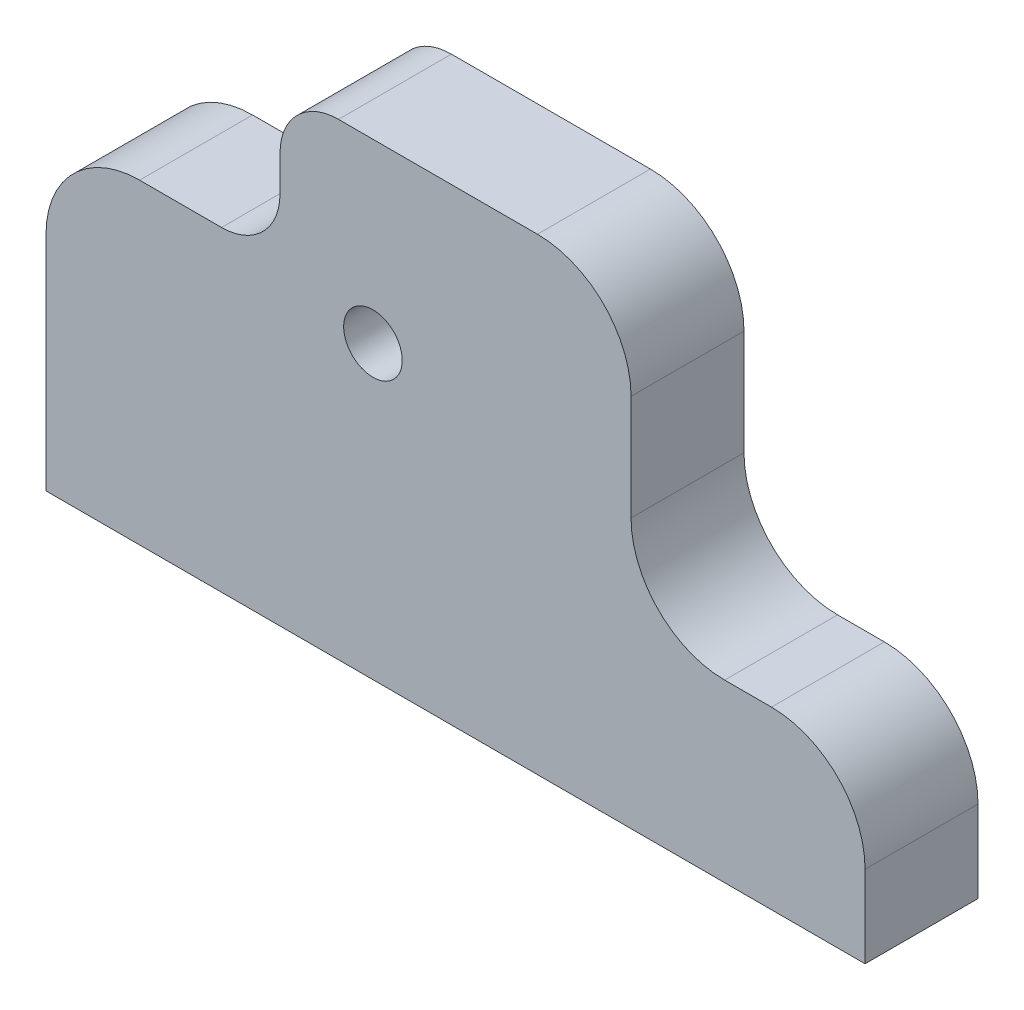
ISO-10303-21;
HEADER;
FILE_DESCRIPTION(('STEP AP214'),'2;1');
FILE_NAME('part.step','',(''),(''),'','','');
FILE_SCHEMA(('AUTOMOTIVE_DESIGN { 1 0 10303 214 1 1 1 1 }'));
ENDSEC;
DATA;
#1=APPLICATION_CONTEXT('core data for automotive mechanical design processes');
#2=APPLICATION_PROTOCOL_DEFINITION('international standard','automotive_design',2000,#1);
#3=PRODUCT_CONTEXT('',#1,'mechanical');
#4=PRODUCT('Part','Part','',(#3));
#5=PRODUCT_RELATED_PRODUCT_CATEGORY('part','',(#4));
#6=PRODUCT_DEFINITION_FORMATION('','',#4);
#7=PRODUCT_DEFINITION_CONTEXT('part definition',#1,'design');
#8=PRODUCT_DEFINITION('design','',#6,#7);
#9=PRODUCT_DEFINITION_SHAPE('','',#8);
#10=(LENGTH_UNIT() NAMED_UNIT(*) SI_UNIT(.MILLI.,.METRE.));
#11=(NAMED_UNIT(*) PLANE_ANGLE_UNIT() SI_UNIT($,.RADIAN.));
#12=(NAMED_UNIT(*) SI_UNIT($,.STERADIAN.) SOLID_ANGLE_UNIT());
#13=UNCERTAINTY_MEASURE_WITH_UNIT(LENGTH_MEASURE(1.E-05),#10,'distance_accuracy_value','');
#14=(GEOMETRIC_REPRESENTATION_CONTEXT(3) GLOBAL_UNCERTAINTY_ASSIGNED_CONTEXT((#13)) GLOBAL_UNIT_ASSIGNED_CONTEXT((#10,
#11,#12)) REPRESENTATION_CONTEXT('',''));
#15=CARTESIAN_POINT('',(0.,0.,0.));
#16=DIRECTION('',(0.,0.,1.));
#17=DIRECTION('',(1.,0.,0.));
#18=AXIS2_PLACEMENT_3D('',#15,#16,#17);
#19=CARTESIAN_POINT('',(10.,0.,4.826));
#20=DIRECTION('',(-1.,0.,0.));
#21=DIRECTION('',(0.,0.,1.));
#22=AXIS2_PLACEMENT_3D('',#19,#20,#21);
#23=PLANE('',#22);
#24=DIRECTION('',(0.,1.,0.));
#25=VECTOR('',#24,1.);
#26=CARTESIAN_POINT('',(10.,0.,4.826));
#27=LINE('',#26,#25);
#28=CARTESIAN_POINT('',(10.,16.,4.826));
#29=VERTEX_POINT('',#28);
#30=CARTESIAN_POINT('',(10.,17.5,4.826));
#31=VERTEX_POINT('',#30);
#32=EDGE_CURVE('E173',#29,#31,#27,.T.);
#33=ORIENTED_EDGE('',*,*,#32,.T.);
#34=DIRECTION('',(0.,0.,-1.));
#35=VECTOR('',#34,1.);
#36=CARTESIAN_POINT('',(10.,17.5,4.826));
#37=LINE('',#36,#35);
#38=CARTESIAN_POINT('',(10.,17.5,0.));
#39=VERTEX_POINT('',#38);
#40=EDGE_CURVE('E222',#31,#39,#37,.T.);
#41=ORIENTED_EDGE('',*,*,#40,.T.);
#42=DIRECTION('',(0.,1.,0.));
#43=VECTOR('',#42,1.);
#44=CARTESIAN_POINT('',(10.,0.,0.));
#45=LINE('',#44,#43);
#46=CARTESIAN_POINT('',(10.,16.,0.));
#47=VERTEX_POINT('',#46);
#48=EDGE_CURVE('E172',#47,#39,#45,.T.);
#49=ORIENTED_EDGE('',*,*,#48,.F.);
#50=DIRECTION('',(0.,0.,-1.));
#51=VECTOR('',#50,1.);
#52=CARTESIAN_POINT('',(10.,16.,4.826));
#53=LINE('',#52,#51);
#54=EDGE_CURVE('E220',#47,#29,#53,.F.);
#55=ORIENTED_EDGE('',*,*,#54,.T.);
#56=EDGE_LOOP('',(#33,#41,#49,#55));
#57=FACE_BOUND('',#56,.T.);
#58=ADVANCED_FACE('F40',(#57),#23,.T.);
#59=CARTESIAN_POINT('',(0.,13.5,4.826));
#60=DIRECTION('',(0.,1.,0.));
#61=DIRECTION('',(0.,0.,1.));
#62=AXIS2_PLACEMENT_3D('',#59,#60,#61);
#63=PLANE('',#62);
#64=DIRECTION('',(1.,0.,0.));
#65=VECTOR('',#64,1.);
#66=CARTESIAN_POINT('',(0.,13.5,0.));
#67=LINE('',#66,#65);
#68=CARTESIAN_POINT('',(4.,13.5,0.));
#69=VERTEX_POINT('',#68);
#70=CARTESIAN_POINT('',(7.5,13.5,0.));
#71=VERTEX_POINT('',#70);
#72=EDGE_CURVE('E198',#69,#71,#67,.T.);
#73=ORIENTED_EDGE('',*,*,#72,.F.);
#74=DIRECTION('',(0.,0.,-1.));
#75=VECTOR('',#74,1.);
#76=CARTESIAN_POINT('',(4.,13.5,4.826));
#77=LINE('',#76,#75);
#78=CARTESIAN_POINT('',(4.,13.5,4.826));
#79=VERTEX_POINT('',#78);
#80=EDGE_CURVE('E268',#69,#79,#77,.F.);
#81=ORIENTED_EDGE('',*,*,#80,.T.);
#82=DIRECTION('',(1.,0.,0.));
#83=VECTOR('',#82,1.);
#84=CARTESIAN_POINT('',(0.,13.5,4.826));
#85=LINE('',#84,#83);
#86=CARTESIAN_POINT('',(7.5,13.5,4.826));
#87=VERTEX_POINT('',#86);
#88=EDGE_CURVE('E176',#79,#87,#85,.T.);
#89=ORIENTED_EDGE('',*,*,#88,.T.);
#90=DIRECTION('',(0.,0.,-1.));
#91=VECTOR('',#90,1.);
#92=CARTESIAN_POINT('',(7.5,13.5,0.));
#93=LINE('',#92,#91);
#94=EDGE_CURVE('E231',#87,#71,#93,.T.);
#95=ORIENTED_EDGE('',*,*,#94,.T.);
#96=EDGE_LOOP('',(#73,#81,#89,#95));
#97=FACE_BOUND('',#96,.T.);
#98=ADVANCED_FACE('F307',(#97),#63,.T.);
#99=CARTESIAN_POINT('',(0.,0.,4.826));
#100=DIRECTION('',(-1.,0.,0.));
#101=DIRECTION('',(0.,0.,1.));
#102=AXIS2_PLACEMENT_3D('',#99,#100,#101);
#103=PLANE('',#102);
#104=DIRECTION('',(0.,1.,0.));
#105=VECTOR('',#104,1.);
#106=CARTESIAN_POINT('',(0.,0.,4.826));
#107=LINE('',#106,#105);
#108=CARTESIAN_POINT('',(0.,0.,4.826));
#109=VERTEX_POINT('',#108);
#110=CARTESIAN_POINT('',(0.,9.5,4.826));
#111=VERTEX_POINT('',#110);
#112=EDGE_CURVE('E179',#109,#111,#107,.T.);
#113=ORIENTED_EDGE('',*,*,#112,.T.);
#114=DIRECTION('',(0.,0.,-1.));
#115=VECTOR('',#114,1.);
#116=CARTESIAN_POINT('',(0.,9.5,4.826));
#117=LINE('',#116,#115);
#118=CARTESIAN_POINT('',(0.,9.5,0.));
#119=VERTEX_POINT('',#118);
#120=EDGE_CURVE('E265',#111,#119,#117,.T.);
#121=ORIENTED_EDGE('',*,*,#120,.T.);
#122=DIRECTION('',(0.,1.,0.));
#123=VECTOR('',#122,1.);
#124=CARTESIAN_POINT('',(0.,0.,0.));
#125=LINE('',#124,#123);
#126=CARTESIAN_POINT('',(0.,0.,0.));
#127=VERTEX_POINT('',#126);
#128=EDGE_CURVE('E200',#127,#119,#125,.T.);
#129=ORIENTED_EDGE('',*,*,#128,.F.);
#130=DIRECTION('',(0.,0.,-1.));
#131=VECTOR('',#130,1.);
#132=CARTESIAN_POINT('',(0.,0.,4.826));
#133=LINE('',#132,#131);
#134=EDGE_CURVE('E218',#109,#127,#133,.T.);
#135=ORIENTED_EDGE('',*,*,#134,.F.);
#136=EDGE_LOOP('',(#113,#121,#129,#135));
#137=FACE_BOUND('',#136,.T.);
#138=ADVANCED_FACE('F315',(#137),#103,.T.);
#139=CARTESIAN_POINT('',(0.,0.,4.826));
#140=DIRECTION('',(0.,-1.,0.));
#141=DIRECTION('',(1.,0.,0.));
#142=AXIS2_PLACEMENT_3D('',#139,#140,#141);
#143=PLANE('',#142);
#144=CARTESIAN_POINT('',(16.73,0.,2.413));
#145=DIRECTION('',(0.,-1.,0.));
#146=DIRECTION('',(0.,0.,-1.));
#147=AXIS2_PLACEMENT_3D('',#144,#145,#146);
#148=CIRCLE('',#147,1.24999999999999);
#149=CARTESIAN_POINT('',(16.73,0.,1.16300000000001));
#150=VERTEX_POINT('',#149);
#151=EDGE_CURVE('E156',#150,#150,#148,.T.);
#152=ORIENTED_EDGE('',*,*,#151,.F.);
#153=EDGE_LOOP('',(#152));
#154=FACE_BOUND('',#153,.T.);
#155=CARTESIAN_POINT('',(28.73,0.,2.413));
#156=DIRECTION('',(0.,-1.,0.));
#157=DIRECTION('',(0.,0.,-1.));
#158=AXIS2_PLACEMENT_3D('',#155,#156,#157);
#159=CIRCLE('',#158,1.24999999999999);
#160=CARTESIAN_POINT('',(28.73,0.,1.16300000000001));
#161=VERTEX_POINT('',#160);
#162=EDGE_CURVE('E155',#161,#161,#159,.T.);
#163=ORIENTED_EDGE('',*,*,#162,.F.);
#164=EDGE_LOOP('',(#163));
#165=FACE_BOUND('',#164,.T.);
#166=DIRECTION('',(-1.,0.,0.));
#167=VECTOR('',#166,1.);
#168=CARTESIAN_POINT('',(0.,0.,0.));
#169=LINE('',#168,#167);
#170=CARTESIAN_POINT('',(35.,0.,0.));
#171=VERTEX_POINT('',#170);
#172=EDGE_CURVE('E203',#171,#127,#169,.T.);
#173=ORIENTED_EDGE('',*,*,#172,.F.);
#174=DIRECTION('',(0.,0.,-1.));
#175=VECTOR('',#174,1.);
#176=CARTESIAN_POINT('',(35.,0.,4.826));
#177=LINE('',#176,#175);
#178=CARTESIAN_POINT('',(35.,0.,4.826));
#179=VERTEX_POINT('',#178);
#180=EDGE_CURVE('E195',#179,#171,#177,.T.);
#181=ORIENTED_EDGE('',*,*,#180,.F.);
#182=DIRECTION('',(-1.,0.,0.));
#183=VECTOR('',#182,1.);
#184=CARTESIAN_POINT('',(0.,0.,4.826));
#185=LINE('',#184,#183);
#186=EDGE_CURVE('E182',#179,#109,#185,.T.);
#187=ORIENTED_EDGE('',*,*,#186,.T.);
#188=ORIENTED_EDGE('',*,*,#134,.T.);
#189=EDGE_LOOP('',(#173,#181,#187,#188));
#190=FACE_BOUND('',#189,.T.);
#191=ADVANCED_FACE('F320',(#154,#165,#190),#143,.T.);
#192=CARTESIAN_POINT('',(35.,0.,4.826));
#193=DIRECTION('',(1.,0.,0.));
#194=DIRECTION('',(0.,0.,-1.));
#195=AXIS2_PLACEMENT_3D('',#192,#193,#194);
#196=PLANE('',#195);
#197=DIRECTION('',(0.,-1.,0.));
#198=VECTOR('',#197,1.);
#199=CARTESIAN_POINT('',(35.,0.,0.));
#200=LINE('',#199,#198);
#201=CARTESIAN_POINT('',(35.,3.5,0.));
#202=VERTEX_POINT('',#201);
#203=EDGE_CURVE('E206',#202,#171,#200,.T.);
#204=ORIENTED_EDGE('',*,*,#203,.F.);
#205=DIRECTION('',(0.,0.,-1.));
#206=VECTOR('',#205,1.);
#207=CARTESIAN_POINT('',(35.,3.5,4.826));
#208=LINE('',#207,#206);
#209=CARTESIAN_POINT('',(35.,3.5,4.826));
#210=VERTEX_POINT('',#209);
#211=EDGE_CURVE('E250',#202,#210,#208,.F.);
#212=ORIENTED_EDGE('',*,*,#211,.T.);
#213=DIRECTION('',(0.,-1.,0.));
#214=VECTOR('',#213,1.);
#215=CARTESIAN_POINT('',(35.,0.,4.826));
#216=LINE('',#215,#214);
#217=EDGE_CURVE('E185',#210,#179,#216,.T.);
#218=ORIENTED_EDGE('',*,*,#217,.T.);
#219=ORIENTED_EDGE('',*,*,#180,.T.);
#220=EDGE_LOOP('',(#204,#212,#218,#219));
#221=FACE_BOUND('',#220,.T.);
#222=ADVANCED_FACE('F327',(#221),#196,.T.);
#223=CARTESIAN_POINT('',(0.,7.5,4.826));
#224=DIRECTION('',(0.,1.,0.));
#225=DIRECTION('',(0.,0.,1.));
#226=AXIS2_PLACEMENT_3D('',#223,#224,#225);
#227=PLANE('',#226);
#228=DIRECTION('',(1.,0.,0.));
#229=VECTOR('',#228,1.);
#230=CARTESIAN_POINT('',(0.,7.5,4.826));
#231=LINE('',#230,#229);
#232=CARTESIAN_POINT('',(29.,7.5,4.826));
#233=VERTEX_POINT('',#232);
#234=CARTESIAN_POINT('',(31.,7.5,4.826));
#235=VERTEX_POINT('',#234);
#236=EDGE_CURVE('E187',#233,#235,#231,.T.);
#237=ORIENTED_EDGE('',*,*,#236,.T.);
#238=DIRECTION('',(0.,0.,-1.));
#239=VECTOR('',#238,1.);
#240=CARTESIAN_POINT('',(31.,7.5,4.826));
#241=LINE('',#240,#239);
#242=CARTESIAN_POINT('',(31.,7.5,0.));
#243=VERTEX_POINT('',#242);
#244=EDGE_CURVE('E241',#235,#243,#241,.T.);
#245=ORIENTED_EDGE('',*,*,#244,.T.);
#246=DIRECTION('',(1.,0.,0.));
#247=VECTOR('',#246,1.);
#248=CARTESIAN_POINT('',(0.,7.5,0.));
#249=LINE('',#248,#247);
#250=CARTESIAN_POINT('',(29.,7.5,0.));
#251=VERTEX_POINT('',#250);
#252=EDGE_CURVE('E208',#251,#243,#249,.T.);
#253=ORIENTED_EDGE('',*,*,#252,.F.);
#254=DIRECTION('',(0.,0.,-1.));
#255=VECTOR('',#254,1.);
#256=CARTESIAN_POINT('',(29.,7.5,4.826));
#257=LINE('',#256,#255);
#258=EDGE_CURVE('E239',#251,#233,#257,.F.);
#259=ORIENTED_EDGE('',*,*,#258,.T.);
#260=EDGE_LOOP('',(#237,#245,#253,#259));
#261=FACE_BOUND('',#260,.T.);
#262=ADVANCED_FACE('F276',(#261),#227,.T.);
#263=CARTESIAN_POINT('',(25.,0.,4.826));
#264=DIRECTION('',(1.,0.,0.));
#265=DIRECTION('',(0.,0.,-1.));
#266=AXIS2_PLACEMENT_3D('',#263,#264,#265);
#267=PLANE('',#266);
#268=DIRECTION('',(0.,-1.,0.));
#269=VECTOR('',#268,1.);
#270=CARTESIAN_POINT('',(25.,0.,4.826));
#271=LINE('',#270,#269);
#272=CARTESIAN_POINT('',(25.,16.,4.826));
#273=VERTEX_POINT('',#272);
#274=CARTESIAN_POINT('',(25.,11.5,4.826));
#275=VERTEX_POINT('',#274);
#276=EDGE_CURVE('E190',#273,#275,#271,.T.);
#277=ORIENTED_EDGE('',*,*,#276,.T.);
#278=DIRECTION('',(0.,0.,-1.));
#279=VECTOR('',#278,1.);
#280=CARTESIAN_POINT('',(25.,11.5,0.));
#281=LINE('',#280,#279);
#282=CARTESIAN_POINT('',(25.,11.5,0.));
#283=VERTEX_POINT('',#282);
#284=EDGE_CURVE('E259',#275,#283,#281,.T.);
#285=ORIENTED_EDGE('',*,*,#284,.T.);
#286=DIRECTION('',(0.,-1.,0.));
#287=VECTOR('',#286,1.);
#288=CARTESIAN_POINT('',(25.,0.,0.));
#289=LINE('',#288,#287);
#290=CARTESIAN_POINT('',(25.,16.,0.));
#291=VERTEX_POINT('',#290);
#292=EDGE_CURVE('E211',#291,#283,#289,.T.);
#293=ORIENTED_EDGE('',*,*,#292,.F.);
#294=DIRECTION('',(0.,0.,-1.));
#295=VECTOR('',#294,1.);
#296=CARTESIAN_POINT('',(25.,16.,4.826));
#297=LINE('',#296,#295);
#298=EDGE_CURVE('E60',#291,#273,#297,.F.);
#299=ORIENTED_EDGE('',*,*,#298,.T.);
#300=EDGE_LOOP('',(#277,#285,#293,#299));
#301=FACE_BOUND('',#300,.T.);
#302=ADVANCED_FACE('F279',(#301),#267,.T.);
#303=CARTESIAN_POINT('',(0.,20.,4.826));
#304=DIRECTION('',(0.,1.,0.));
#305=DIRECTION('',(-1.,0.,0.));
#306=AXIS2_PLACEMENT_3D('',#303,#304,#305);
#307=PLANE('',#306);
#308=DIRECTION('',(1.,0.,0.));
#309=VECTOR('',#308,1.);
#310=CARTESIAN_POINT('',(0.,20.,4.826));
#311=LINE('',#310,#309);
#312=CARTESIAN_POINT('',(12.5,20.,4.826));
#313=VERTEX_POINT('',#312);
#314=CARTESIAN_POINT('',(21.,20.,4.826));
#315=VERTEX_POINT('',#314);
#316=EDGE_CURVE('E192',#313,#315,#311,.T.);
#317=ORIENTED_EDGE('',*,*,#316,.T.);
#318=DIRECTION('',(0.,0.,-1.));
#319=VECTOR('',#318,1.);
#320=CARTESIAN_POINT('',(21.,20.,4.826));
#321=LINE('',#320,#319);
#322=CARTESIAN_POINT('',(21.,20.,0.));
#323=VERTEX_POINT('',#322);
#324=EDGE_CURVE('E262',#315,#323,#321,.T.);
#325=ORIENTED_EDGE('',*,*,#324,.T.);
#326=DIRECTION('',(1.,0.,0.));
#327=VECTOR('',#326,1.);
#328=CARTESIAN_POINT('',(0.,20.,0.));
#329=LINE('',#328,#327);
#330=CARTESIAN_POINT('',(12.5,20.,0.));
#331=VERTEX_POINT('',#330);
#332=EDGE_CURVE('E177',#331,#323,#329,.T.);
#333=ORIENTED_EDGE('',*,*,#332,.F.);
#334=DIRECTION('',(0.,0.,-1.));
#335=VECTOR('',#334,1.);
#336=CARTESIAN_POINT('',(12.5,20.,4.826));
#337=LINE('',#336,#335);
#338=EDGE_CURVE('E227',#331,#313,#337,.F.);
#339=ORIENTED_EDGE('',*,*,#338,.T.);
#340=EDGE_LOOP('',(#317,#325,#333,#339));
#341=FACE_BOUND('',#340,.T.);
#342=ADVANCED_FACE('F289',(#341),#307,.T.);
#343=CARTESIAN_POINT('',(0.,0.,4.826));
#344=DIRECTION('',(0.,0.,1.));
#345=DIRECTION('',(1.,0.,0.));
#346=AXIS2_PLACEMENT_3D('',#343,#344,#345);
#347=PLANE('',#346);
#348=CARTESIAN_POINT('',(13.97024649,12.44,4.826));
#349=DIRECTION('',(0.,0.,1.));
#350=DIRECTION('',(1.,0.,0.));
#351=AXIS2_PLACEMENT_3D('',#348,#349,#350);
#352=CIRCLE('',#351,1.24999999999999);
#353=CARTESIAN_POINT('',(15.22024649,12.44,4.826));
#354=VERTEX_POINT('',#353);
#355=EDGE_CURVE('E166',#354,#354,#352,.T.);
#356=ORIENTED_EDGE('',*,*,#355,.F.);
#357=EDGE_LOOP('',(#356));
#358=FACE_BOUND('',#357,.T.);
#359=ORIENTED_EDGE('',*,*,#217,.F.);
#360=CARTESIAN_POINT('',(31.,3.5,4.826));
#361=DIRECTION('',(0.,0.,1.));
#362=DIRECTION('',(1.,0.,0.));
#363=AXIS2_PLACEMENT_3D('',#360,#361,#362);
#364=CIRCLE('',#363,4.);
#365=EDGE_CURVE('E256',#210,#235,#364,.T.);
#366=ORIENTED_EDGE('',*,*,#365,.T.);
#367=ORIENTED_EDGE('',*,*,#236,.F.);
#368=CARTESIAN_POINT('',(29.,11.5,4.826));
#369=DIRECTION('',(0.,0.,1.));
#370=DIRECTION('',(1.,0.,0.));
#371=AXIS2_PLACEMENT_3D('',#368,#369,#370);
#372=CIRCLE('',#371,4.);
#373=EDGE_CURVE('E11',#233,#275,#372,.F.);
#374=ORIENTED_EDGE('',*,*,#373,.T.);
#375=ORIENTED_EDGE('',*,*,#276,.F.);
#376=CARTESIAN_POINT('',(21.,16.,4.826));
#377=DIRECTION('',(0.,0.,1.));
#378=DIRECTION('',(1.,0.,0.));
#379=AXIS2_PLACEMENT_3D('',#376,#377,#378);
#380=CIRCLE('',#379,4.);
#381=EDGE_CURVE('E254',#273,#315,#380,.T.);
#382=ORIENTED_EDGE('',*,*,#381,.T.);
#383=ORIENTED_EDGE('',*,*,#316,.F.);
#384=CARTESIAN_POINT('',(12.5,17.5,4.826));
#385=DIRECTION('',(0.,0.,1.));
#386=DIRECTION('',(1.,0.,0.));
#387=AXIS2_PLACEMENT_3D('',#384,#385,#386);
#388=CIRCLE('',#387,2.5);
#389=EDGE_CURVE('E229',#313,#31,#388,.T.);
#390=ORIENTED_EDGE('',*,*,#389,.T.);
#391=ORIENTED_EDGE('',*,*,#32,.F.);
#392=CARTESIAN_POINT('',(7.5,16.,4.826));
#393=DIRECTION('',(0.,0.,1.));
#394=DIRECTION('',(1.,0.,0.));
#395=AXIS2_PLACEMENT_3D('',#392,#393,#394);
#396=CIRCLE('',#395,2.5);
#397=EDGE_CURVE('E236',#29,#87,#396,.F.);
#398=ORIENTED_EDGE('',*,*,#397,.T.);
#399=ORIENTED_EDGE('',*,*,#88,.F.);
#400=CARTESIAN_POINT('',(4.,9.5,4.826));
#401=DIRECTION('',(0.,0.,1.));
#402=DIRECTION('',(1.,0.,0.));
#403=AXIS2_PLACEMENT_3D('',#400,#401,#402);
#404=CIRCLE('',#403,4.);
#405=EDGE_CURVE('E252',#79,#111,#404,.T.);
#406=ORIENTED_EDGE('',*,*,#405,.T.);
#407=ORIENTED_EDGE('',*,*,#112,.F.);
#408=ORIENTED_EDGE('',*,*,#186,.F.);
#409=EDGE_LOOP('',(#359,#366,#367,#374,#375,#382,#383,#390,#391,#398,#399,#406,#407,#408));
#410=FACE_BOUND('',#409,.T.);
#411=ADVANCED_FACE('F282',(#358,#410),#347,.T.);
#412=CARTESIAN_POINT('',(0.,0.,0.));
#413=DIRECTION('',(0.,0.,1.));
#414=DIRECTION('',(1.,0.,0.));
#415=AXIS2_PLACEMENT_3D('',#412,#413,#414);
#416=PLANE('',#415);
#417=CARTESIAN_POINT('',(13.97024649,12.44,0.));
#418=DIRECTION('',(0.,0.,1.));
#419=DIRECTION('',(1.,0.,0.));
#420=AXIS2_PLACEMENT_3D('',#417,#418,#419);
#421=CIRCLE('',#420,1.25);
#422=CARTESIAN_POINT('',(15.22024649,12.44,0.));
#423=VERTEX_POINT('',#422);
#424=EDGE_CURVE('E169',#423,#423,#421,.T.);
#425=ORIENTED_EDGE('',*,*,#424,.T.);
#426=EDGE_LOOP('',(#425));
#427=FACE_BOUND('',#426,.T.);
#428=ORIENTED_EDGE('',*,*,#252,.T.);
#429=CARTESIAN_POINT('',(31.,3.5,0.));
#430=DIRECTION('',(0.,0.,1.));
#431=DIRECTION('',(1.,0.,0.));
#432=AXIS2_PLACEMENT_3D('',#429,#430,#431);
#433=CIRCLE('',#432,4.);
#434=EDGE_CURVE('E248',#243,#202,#433,.F.);
#435=ORIENTED_EDGE('',*,*,#434,.T.);
#436=ORIENTED_EDGE('',*,*,#203,.T.);
#437=ORIENTED_EDGE('',*,*,#172,.T.);
#438=ORIENTED_EDGE('',*,*,#128,.T.);
#439=CARTESIAN_POINT('',(4.,9.5,0.));
#440=DIRECTION('',(0.,0.,1.));
#441=DIRECTION('',(1.,0.,0.));
#442=AXIS2_PLACEMENT_3D('',#439,#440,#441);
#443=CIRCLE('',#442,4.);
#444=EDGE_CURVE('E244',#119,#69,#443,.F.);
#445=ORIENTED_EDGE('',*,*,#444,.T.);
#446=ORIENTED_EDGE('',*,*,#72,.T.);
#447=CARTESIAN_POINT('',(7.5,16.,0.));
#448=DIRECTION('',(0.,0.,1.));
#449=DIRECTION('',(1.,0.,0.));
#450=AXIS2_PLACEMENT_3D('',#447,#448,#449);
#451=CIRCLE('',#450,2.5);
#452=EDGE_CURVE('E234',#71,#47,#451,.T.);
#453=ORIENTED_EDGE('',*,*,#452,.T.);
#454=ORIENTED_EDGE('',*,*,#48,.T.);
#455=CARTESIAN_POINT('',(12.5,17.5,0.));
#456=DIRECTION('',(0.,0.,1.));
#457=DIRECTION('',(1.,0.,0.));
#458=AXIS2_PLACEMENT_3D('',#455,#456,#457);
#459=CIRCLE('',#458,2.5);
#460=EDGE_CURVE('E225',#39,#331,#459,.F.);
#461=ORIENTED_EDGE('',*,*,#460,.T.);
#462=ORIENTED_EDGE('',*,*,#332,.T.);
#463=CARTESIAN_POINT('',(21.,16.,0.));
#464=DIRECTION('',(0.,0.,1.));
#465=DIRECTION('',(1.,0.,0.));
#466=AXIS2_PLACEMENT_3D('',#463,#464,#465);
#467=CIRCLE('',#466,4.);
#468=EDGE_CURVE('E246',#323,#291,#467,.F.);
#469=ORIENTED_EDGE('',*,*,#468,.T.);
#470=ORIENTED_EDGE('',*,*,#292,.T.);
#471=CARTESIAN_POINT('',(29.,11.5,0.));
#472=DIRECTION('',(0.,0.,1.));
#473=DIRECTION('',(1.,0.,0.));
#474=AXIS2_PLACEMENT_3D('',#471,#472,#473);
#475=CIRCLE('',#474,4.);
#476=EDGE_CURVE('E48',#283,#251,#475,.T.);
#477=ORIENTED_EDGE('',*,*,#476,.T.);
#478=EDGE_LOOP('',(#428,#435,#436,#437,#438,#445,#446,#453,#454,#461,#462,#469,#470,#477));
#479=FACE_BOUND('',#478,.T.);
#480=ADVANCED_FACE('F271',(#427,#479),#416,.F.);
#481=CARTESIAN_POINT('',(13.97024649,12.44,4.826));
#482=DIRECTION('',(0.,0.,1.));
#483=DIRECTION('',(1.,0.,0.));
#484=AXIS2_PLACEMENT_3D('',#481,#482,#483);
#485=CYLINDRICAL_SURFACE('',#484,1.24999999999999);
#486=ORIENTED_EDGE('',*,*,#424,.F.);
#487=EDGE_LOOP('',(#486));
#488=FACE_BOUND('',#487,.T.);
#489=ORIENTED_EDGE('',*,*,#355,.T.);
#490=EDGE_LOOP('',(#489));
#491=FACE_BOUND('',#490,.T.);
#492=ADVANCED_FACE('F384',(#488,#491),#485,.F.);
#493=CARTESIAN_POINT('',(28.73,5.,2.413));
#494=DIRECTION('',(0.,-1.,0.));
#495=DIRECTION('',(0.,0.,-1.));
#496=AXIS2_PLACEMENT_3D('',#493,#494,#495);
#497=CONICAL_SURFACE('',#496,1.25,1.02974425867665);
#498=CARTESIAN_POINT('',(28.73,5.75107577378445,2.413));
#499=VERTEX_POINT('',#498);
#500=VERTEX_LOOP('',#499);
#501=FACE_BOUND('',#500,.T.);
#502=CARTESIAN_POINT('',(28.73,5.,2.413));
#503=DIRECTION('',(0.,-1.,0.));
#504=DIRECTION('',(0.,0.,-1.));
#505=AXIS2_PLACEMENT_3D('',#502,#503,#504);
#506=CIRCLE('',#505,1.25);
#507=CARTESIAN_POINT('',(28.73,5.,1.163));
#508=VERTEX_POINT('',#507);
#509=EDGE_CURVE('E159',#508,#508,#506,.T.);
#510=ORIENTED_EDGE('',*,*,#509,.T.);
#511=EDGE_LOOP('',(#510));
#512=FACE_BOUND('',#511,.T.);
#513=ADVANCED_FACE('F478',(#501,#512),#497,.F.);
#514=CARTESIAN_POINT('',(28.73,0.,2.413));
#515=DIRECTION('',(0.,-1.,0.));
#516=DIRECTION('',(0.,0.,-1.));
#517=AXIS2_PLACEMENT_3D('',#514,#515,#516);
#518=CYLINDRICAL_SURFACE('',#517,1.24999999999999);
#519=ORIENTED_EDGE('',*,*,#509,.F.);
#520=EDGE_LOOP('',(#519));
#521=FACE_BOUND('',#520,.T.);
#522=ORIENTED_EDGE('',*,*,#162,.T.);
#523=EDGE_LOOP('',(#522));
#524=FACE_BOUND('',#523,.T.);
#525=ADVANCED_FACE('F149',(#521,#524),#518,.F.);
#526=CARTESIAN_POINT('',(16.73,5.,2.413));
#527=DIRECTION('',(0.,-1.,0.));
#528=DIRECTION('',(0.,0.,-1.));
#529=AXIS2_PLACEMENT_3D('',#526,#527,#528);
#530=CONICAL_SURFACE('',#529,1.25,1.02974425867665);
#531=CARTESIAN_POINT('',(16.73,5.75107577378445,2.413));
#532=VERTEX_POINT('',#531);
#533=VERTEX_LOOP('',#532);
#534=FACE_BOUND('',#533,.T.);
#535=CARTESIAN_POINT('',(16.73,5.,2.413));
#536=DIRECTION('',(0.,-1.,0.));
#537=DIRECTION('',(0.,0.,-1.));
#538=AXIS2_PLACEMENT_3D('',#535,#536,#537);
#539=CIRCLE('',#538,1.25);
#540=CARTESIAN_POINT('',(16.73,5.,1.163));
#541=VERTEX_POINT('',#540);
#542=EDGE_CURVE('E153',#541,#541,#539,.T.);
#543=ORIENTED_EDGE('',*,*,#542,.T.);
#544=EDGE_LOOP('',(#543));
#545=FACE_BOUND('',#544,.T.);
#546=ADVANCED_FACE('F145',(#534,#545),#530,.F.);
#547=CARTESIAN_POINT('',(16.73,0.,2.413));
#548=DIRECTION('',(0.,-1.,0.));
#549=DIRECTION('',(0.,0.,-1.));
#550=AXIS2_PLACEMENT_3D('',#547,#548,#549);
#551=CYLINDRICAL_SURFACE('',#550,1.24999999999999);
#552=ORIENTED_EDGE('',*,*,#542,.F.);
#553=EDGE_LOOP('',(#552));
#554=FACE_BOUND('',#553,.T.);
#555=ORIENTED_EDGE('',*,*,#151,.T.);
#556=EDGE_LOOP('',(#555));
#557=FACE_BOUND('',#556,.T.);
#558=ADVANCED_FACE('F148',(#554,#557),#551,.F.);
#559=CARTESIAN_POINT('',(12.5,17.5,4.826));
#560=DIRECTION('',(0.,0.,-1.));
#561=DIRECTION('',(-1.,0.,0.));
#562=AXIS2_PLACEMENT_3D('',#559,#560,#561);
#563=CYLINDRICAL_SURFACE('',#562,2.5);
#564=ORIENTED_EDGE('',*,*,#389,.F.);
#565=ORIENTED_EDGE('',*,*,#338,.F.);
#566=ORIENTED_EDGE('',*,*,#460,.F.);
#567=ORIENTED_EDGE('',*,*,#40,.F.);
#568=EDGE_LOOP('',(#564,#565,#566,#567));
#569=FACE_BOUND('',#568,.T.);
#570=ADVANCED_FACE('F295',(#569),#563,.T.);
#571=CARTESIAN_POINT('',(7.5,16.,4.826));
#572=DIRECTION('',(0.,0.,1.));
#573=DIRECTION('',(1.,0.,0.));
#574=AXIS2_PLACEMENT_3D('',#571,#572,#573);
#575=CYLINDRICAL_SURFACE('',#574,2.5);
#576=ORIENTED_EDGE('',*,*,#397,.F.);
#577=ORIENTED_EDGE('',*,*,#54,.F.);
#578=ORIENTED_EDGE('',*,*,#452,.F.);
#579=ORIENTED_EDGE('',*,*,#94,.F.);
#580=EDGE_LOOP('',(#576,#577,#578,#579));
#581=FACE_BOUND('',#580,.T.);
#582=ADVANCED_FACE('F303',(#581),#575,.F.);
#583=CARTESIAN_POINT('',(31.,3.5,4.826));
#584=DIRECTION('',(0.,0.,-1.));
#585=DIRECTION('',(-1.,0.,0.));
#586=AXIS2_PLACEMENT_3D('',#583,#584,#585);
#587=CYLINDRICAL_SURFACE('',#586,4.);
#588=ORIENTED_EDGE('',*,*,#365,.F.);
#589=ORIENTED_EDGE('',*,*,#211,.F.);
#590=ORIENTED_EDGE('',*,*,#434,.F.);
#591=ORIENTED_EDGE('',*,*,#244,.F.);
#592=EDGE_LOOP('',(#588,#589,#590,#591));
#593=FACE_BOUND('',#592,.T.);
#594=ADVANCED_FACE('F326',(#593),#587,.T.);
#595=CARTESIAN_POINT('',(29.,11.5,4.826));
#596=DIRECTION('',(0.,0.,1.));
#597=DIRECTION('',(1.,0.,0.));
#598=AXIS2_PLACEMENT_3D('',#595,#596,#597);
#599=CYLINDRICAL_SURFACE('',#598,4.);
#600=ORIENTED_EDGE('',*,*,#373,.F.);
#601=ORIENTED_EDGE('',*,*,#258,.F.);
#602=ORIENTED_EDGE('',*,*,#476,.F.);
#603=ORIENTED_EDGE('',*,*,#284,.F.);
#604=EDGE_LOOP('',(#600,#601,#602,#603));
#605=FACE_BOUND('',#604,.T.);
#606=ADVANCED_FACE('F278',(#605),#599,.F.);
#607=CARTESIAN_POINT('',(21.,16.,4.826));
#608=DIRECTION('',(0.,0.,-1.));
#609=DIRECTION('',(-1.,0.,0.));
#610=AXIS2_PLACEMENT_3D('',#607,#608,#609);
#611=CYLINDRICAL_SURFACE('',#610,4.);
#612=ORIENTED_EDGE('',*,*,#381,.F.);
#613=ORIENTED_EDGE('',*,*,#298,.F.);
#614=ORIENTED_EDGE('',*,*,#468,.F.);
#615=ORIENTED_EDGE('',*,*,#324,.F.);
#616=EDGE_LOOP('',(#612,#613,#614,#615));
#617=FACE_BOUND('',#616,.T.);
#618=ADVANCED_FACE('F286',(#617),#611,.T.);
#619=CARTESIAN_POINT('',(4.,9.5,4.826));
#620=DIRECTION('',(0.,0.,-1.));
#621=DIRECTION('',(-1.,0.,0.));
#622=AXIS2_PLACEMENT_3D('',#619,#620,#621);
#623=CYLINDRICAL_SURFACE('',#622,4.);
#624=ORIENTED_EDGE('',*,*,#405,.F.);
#625=ORIENTED_EDGE('',*,*,#80,.F.);
#626=ORIENTED_EDGE('',*,*,#444,.F.);
#627=ORIENTED_EDGE('',*,*,#120,.F.);
#628=EDGE_LOOP('',(#624,#625,#626,#627));
#629=FACE_BOUND('',#628,.T.);
#630=ADVANCED_FACE('F42',(#629),#623,.T.);
#631=CLOSED_SHELL('',(#58,#98,#138,#191,#222,#262,#302,#342,#411,#480,#492,#513,#525,#546,#558,
#570,#582,#594,#606,#618,#630));
#632=MANIFOLD_SOLID_BREP('B2',#631);
#633=ADVANCED_BREP_SHAPE_REPRESENTATION('',(#18,#632),#14);
#634=SHAPE_DEFINITION_REPRESENTATION(#9,#633);
ENDSEC;
END-ISO-10303-21;
